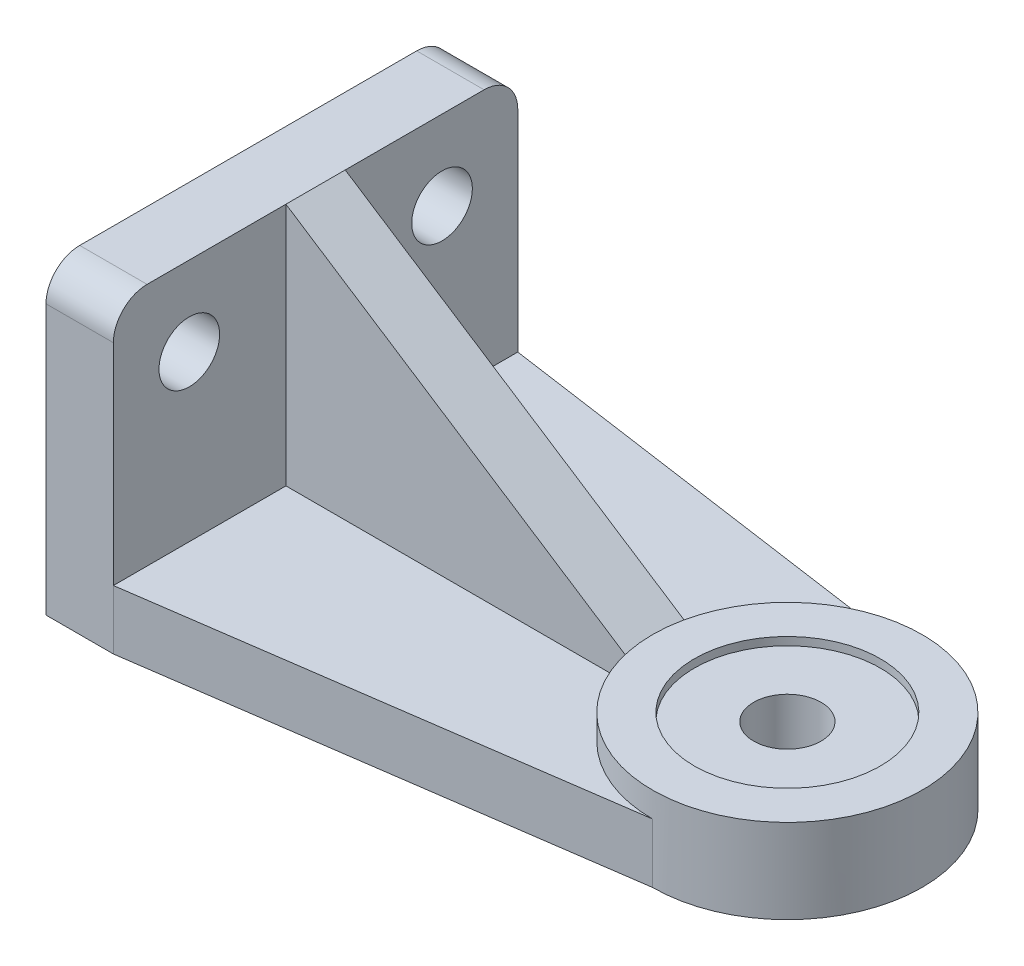
ISO-10303-21;
HEADER;
FILE_DESCRIPTION(('STEP AP214'),'2;1');
FILE_NAME('part.step','',(''),(''),'','','');
FILE_SCHEMA(('AUTOMOTIVE_DESIGN { 1 0 10303 214 1 1 1 1 }'));
ENDSEC;
DATA;
#1=APPLICATION_CONTEXT('core data for automotive mechanical design processes');
#2=APPLICATION_PROTOCOL_DEFINITION('international standard','automotive_design',2000,#1);
#3=PRODUCT_CONTEXT('',#1,'mechanical');
#4=PRODUCT('Part','Part','',(#3));
#5=PRODUCT_RELATED_PRODUCT_CATEGORY('part','',(#4));
#6=PRODUCT_DEFINITION_FORMATION('','',#4);
#7=PRODUCT_DEFINITION_CONTEXT('part definition',#1,'design');
#8=PRODUCT_DEFINITION('design','',#6,#7);
#9=PRODUCT_DEFINITION_SHAPE('','',#8);
#10=(LENGTH_UNIT() NAMED_UNIT(*) SI_UNIT(.MILLI.,.METRE.));
#11=(NAMED_UNIT(*) PLANE_ANGLE_UNIT() SI_UNIT($,.RADIAN.));
#12=(NAMED_UNIT(*) SI_UNIT($,.STERADIAN.) SOLID_ANGLE_UNIT());
#13=UNCERTAINTY_MEASURE_WITH_UNIT(LENGTH_MEASURE(1.E-05),#10,'distance_accuracy_value','');
#14=(GEOMETRIC_REPRESENTATION_CONTEXT(3) GLOBAL_UNCERTAINTY_ASSIGNED_CONTEXT((#13)) GLOBAL_UNIT_ASSIGNED_CONTEXT((#10,
#11,#12)) REPRESENTATION_CONTEXT('',''));
#15=CARTESIAN_POINT('',(0.,0.,0.));
#16=DIRECTION('',(0.,0.,1.));
#17=DIRECTION('',(1.,0.,0.));
#18=AXIS2_PLACEMENT_3D('',#15,#16,#17);
#19=CARTESIAN_POINT('',(0.,11.176,0.));
#20=DIRECTION('',(0.,1.,0.));
#21=DIRECTION('',(0.,0.,1.));
#22=AXIS2_PLACEMENT_3D('',#19,#20,#21);
#23=PLANE('',#22);
#24=DIRECTION('',(0.,0.,1.));
#25=VECTOR('',#24,1.);
#26=CARTESIAN_POINT('',(-88.9,11.176,-38.1));
#27=LINE('',#26,#25);
#28=CARTESIAN_POINT('',(-88.9,11.176,-38.1));
#29=VERTEX_POINT('',#28);
#30=CARTESIAN_POINT('',(-88.9,11.176,-5.588));
#31=VERTEX_POINT('',#30);
#32=EDGE_CURVE('E162',#29,#31,#27,.T.);
#33=ORIENTED_EDGE('',*,*,#32,.T.);
#34=DIRECTION('',(1.,0.,0.));
#35=VECTOR('',#34,1.);
#36=CARTESIAN_POINT('',(-22.86,11.176,-5.588));
#37=LINE('',#36,#35);
#38=CARTESIAN_POINT('',(-24.7776967452586,11.176,-5.588));
#39=VERTEX_POINT('',#38);
#40=EDGE_CURVE('E235',#31,#39,#37,.T.);
#41=ORIENTED_EDGE('',*,*,#40,.T.);
#42=CARTESIAN_POINT('',(0.,11.176,0.));
#43=DIRECTION('',(0.,-1.,0.));
#44=DIRECTION('',(0.,0.,1.));
#45=AXIS2_PLACEMENT_3D('',#42,#43,#44);
#46=CIRCLE('',#45,25.4);
#47=CARTESIAN_POINT('',(0.,11.176,-25.4));
#48=VERTEX_POINT('',#47);
#49=EDGE_CURVE('E176',#39,#48,#46,.T.);
#50=ORIENTED_EDGE('',*,*,#49,.T.);
#51=DIRECTION('',(-0.989949493661167,0.,-0.141421356237309));
#52=VECTOR('',#51,1.);
#53=CARTESIAN_POINT('',(-88.9,11.176,-38.1));
#54=LINE('',#53,#52);
#55=EDGE_CURVE('E163',#48,#29,#54,.T.);
#56=ORIENTED_EDGE('',*,*,#55,.T.);
#57=EDGE_LOOP('',(#33,#41,#50,#56));
#58=FACE_BOUND('',#57,.T.);
#59=ADVANCED_FACE('F39',(#58),#23,.T.);
#60=CARTESIAN_POINT('',(-88.9,57.15,-38.1));
#61=DIRECTION('',(-1.,0.,0.));
#62=DIRECTION('',(0.,0.,1.));
#63=AXIS2_PLACEMENT_3D('',#60,#61,#62);
#64=PLANE('',#63);
#65=CARTESIAN_POINT('',(-88.9,42.164,-23.8252));
#66=DIRECTION('',(1.,0.,0.));
#67=DIRECTION('',(0.,0.,-1.));
#68=AXIS2_PLACEMENT_3D('',#65,#66,#67);
#69=CIRCLE('',#68,5.715);
#70=CARTESIAN_POINT('',(-88.9,42.164,-29.5402));
#71=VERTEX_POINT('',#70);
#72=EDGE_CURVE('E329',#71,#71,#69,.T.);
#73=ORIENTED_EDGE('',*,*,#72,.F.);
#74=EDGE_LOOP('',(#73));
#75=FACE_BOUND('',#74,.T.);
#76=DIRECTION('',(0.,-1.,0.));
#77=VECTOR('',#76,1.);
#78=CARTESIAN_POINT('',(-88.9,57.15,-38.1));
#79=LINE('',#78,#77);
#80=CARTESIAN_POINT('',(-88.9,50.8,-38.1));
#81=VERTEX_POINT('',#80);
#82=EDGE_CURVE('E184',#81,#29,#79,.T.);
#83=ORIENTED_EDGE('',*,*,#82,.F.);
#84=CARTESIAN_POINT('',(-88.9,50.8,-31.75));
#85=DIRECTION('',(-1.,0.,0.));
#86=DIRECTION('',(0.,0.,1.));
#87=AXIS2_PLACEMENT_3D('',#84,#85,#86);
#88=CIRCLE('',#87,6.35);
#89=CARTESIAN_POINT('',(-88.9,57.15,-31.75));
#90=VERTEX_POINT('',#89);
#91=EDGE_CURVE('E225',#81,#90,#88,.F.);
#92=ORIENTED_EDGE('',*,*,#91,.T.);
#93=DIRECTION('',(0.,0.,-1.));
#94=VECTOR('',#93,1.);
#95=CARTESIAN_POINT('',(-88.9,57.15,-38.1));
#96=LINE('',#95,#94);
#97=CARTESIAN_POINT('',(-88.9,57.15,-5.58800000000002));
#98=VERTEX_POINT('',#97);
#99=EDGE_CURVE('E270',#98,#90,#96,.T.);
#100=ORIENTED_EDGE('',*,*,#99,.F.);
#101=DIRECTION('',(0.,-1.,0.));
#102=VECTOR('',#101,1.);
#103=CARTESIAN_POINT('',(-88.9,11.176,-5.588));
#104=LINE('',#103,#102);
#105=EDGE_CURVE('E319',#98,#31,#104,.T.);
#106=ORIENTED_EDGE('',*,*,#105,.T.);
#107=ORIENTED_EDGE('',*,*,#32,.F.);
#108=EDGE_LOOP('',(#83,#92,#100,#106,#107));
#109=FACE_BOUND('',#108,.T.);
#110=ADVANCED_FACE('F346',(#75,#109),#64,.F.);
#111=CARTESIAN_POINT('',(0.,15.875,0.));
#112=DIRECTION('',(0.,-1.,0.));
#113=DIRECTION('',(0.,0.,-1.));
#114=AXIS2_PLACEMENT_3D('',#111,#112,#113);
#115=CYLINDRICAL_SURFACE('',#114,25.4);
#116=CARTESIAN_POINT('',(0.,-0.635,0.));
#117=DIRECTION('',(-0.544988350595414,-0.838443616300637,0.));
#118=DIRECTION('',(0.838443616300637,-0.544988350595414,0.));
#119=AXIS2_PLACEMENT_3D('',#116,#117,#118);
#120=ELLIPSE('',#119,30.2942255223665,25.4);
#121=CARTESIAN_POINT('',(-24.7776967452586,15.4705028844181,5.588));
#122=VERTEX_POINT('',#121);
#123=CARTESIAN_POINT('',(-25.4,15.875,0.));
#124=VERTEX_POINT('',#123);
#125=EDGE_CURVE('E307',#122,#124,#120,.T.);
#126=ORIENTED_EDGE('',*,*,#125,.F.);
#127=DIRECTION('',(0.,-1.,0.));
#128=VECTOR('',#127,1.);
#129=CARTESIAN_POINT('',(-24.7776967452586,15.875,5.588));
#130=LINE('',#129,#128);
#131=CARTESIAN_POINT('',(-24.7776967452586,11.176,5.588));
#132=VERTEX_POINT('',#131);
#133=EDGE_CURVE('E301',#122,#132,#130,.T.);
#134=ORIENTED_EDGE('',*,*,#133,.T.);
#135=CARTESIAN_POINT('',(0.,11.176,25.4));
#136=VERTEX_POINT('',#135);
#137=EDGE_CURVE('E156',#136,#132,#46,.T.);
#138=ORIENTED_EDGE('',*,*,#137,.F.);
#139=DIRECTION('',(0.,-1.,0.));
#140=VECTOR('',#139,1.);
#141=CARTESIAN_POINT('',(0.,11.176,25.4));
#142=LINE('',#141,#140);
#143=CARTESIAN_POINT('',(0.,0.,25.4));
#144=VERTEX_POINT('',#143);
#145=EDGE_CURVE('E191',#136,#144,#142,.T.);
#146=ORIENTED_EDGE('',*,*,#145,.T.);
#147=CARTESIAN_POINT('',(0.,0.,0.));
#148=DIRECTION('',(0.,1.,0.));
#149=DIRECTION('',(0.,0.,1.));
#150=AXIS2_PLACEMENT_3D('',#147,#148,#149);
#151=CIRCLE('',#150,25.4);
#152=CARTESIAN_POINT('',(0.,0.,-25.4));
#153=VERTEX_POINT('',#152);
#154=EDGE_CURVE('E202',#144,#153,#151,.T.);
#155=ORIENTED_EDGE('',*,*,#154,.T.);
#156=DIRECTION('',(0.,-1.,0.));
#157=VECTOR('',#156,1.);
#158=CARTESIAN_POINT('',(0.,11.176,-25.4));
#159=LINE('',#158,#157);
#160=EDGE_CURVE('E179',#48,#153,#159,.T.);
#161=ORIENTED_EDGE('',*,*,#160,.F.);
#162=ORIENTED_EDGE('',*,*,#49,.F.);
#163=DIRECTION('',(0.,-1.,0.));
#164=VECTOR('',#163,1.);
#165=CARTESIAN_POINT('',(-24.7776967452586,15.875,-5.588));
#166=LINE('',#165,#164);
#167=CARTESIAN_POINT('',(-24.7776967452586,15.4705028844181,-5.588));
#168=VERTEX_POINT('',#167);
#169=EDGE_CURVE('E304',#168,#39,#166,.T.);
#170=ORIENTED_EDGE('',*,*,#169,.F.);
#171=EDGE_CURVE('E308',#124,#168,#120,.T.);
#172=ORIENTED_EDGE('',*,*,#171,.F.);
#173=CARTESIAN_POINT('',(0.,15.875,0.));
#174=DIRECTION('',(0.,1.,0.));
#175=DIRECTION('',(0.,0.,1.));
#176=AXIS2_PLACEMENT_3D('',#173,#174,#175);
#177=CIRCLE('',#176,25.4);
#178=EDGE_CURVE('E203',#124,#124,#177,.T.);
#179=ORIENTED_EDGE('',*,*,#178,.F.);
#180=EDGE_LOOP('',(#126,#134,#138,#146,#155,#161,#162,#170,#172,#179));
#181=FACE_BOUND('',#180,.T.);
#182=ADVANCED_FACE('F239',(#181),#115,.T.);
#183=CARTESIAN_POINT('',(0.,15.875,0.));
#184=DIRECTION('',(0.,1.,0.));
#185=DIRECTION('',(0.,0.,1.));
#186=AXIS2_PLACEMENT_3D('',#183,#184,#185);
#187=PLANE('',#186);
#188=CARTESIAN_POINT('',(0.,15.875,0.));
#189=DIRECTION('',(0.,1.,0.));
#190=DIRECTION('',(0.,0.,1.));
#191=AXIS2_PLACEMENT_3D('',#188,#189,#190);
#192=CIRCLE('',#191,17.526);
#193=CARTESIAN_POINT('',(0.,15.875,17.526));
#194=VERTEX_POINT('',#193);
#195=EDGE_CURVE('E297',#194,#194,#192,.T.);
#196=ORIENTED_EDGE('',*,*,#195,.F.);
#197=EDGE_LOOP('',(#196));
#198=FACE_BOUND('',#197,.T.);
#199=ORIENTED_EDGE('',*,*,#178,.T.);
#200=EDGE_LOOP('',(#199));
#201=FACE_BOUND('',#200,.T.);
#202=ADVANCED_FACE('F366',(#198,#201),#187,.T.);
#203=CARTESIAN_POINT('',(0.,0.,0.));
#204=DIRECTION('',(0.,1.,0.));
#205=DIRECTION('',(0.,0.,1.));
#206=AXIS2_PLACEMENT_3D('',#203,#204,#205);
#207=PLANE('',#206);
#208=CARTESIAN_POINT('',(0.,0.,0.));
#209=DIRECTION('',(0.,1.,0.));
#210=DIRECTION('',(0.,0.,1.));
#211=AXIS2_PLACEMENT_3D('',#208,#209,#210);
#212=CIRCLE('',#211,6.35);
#213=CARTESIAN_POINT('',(0.,0.,6.35));
#214=VERTEX_POINT('',#213);
#215=EDGE_CURVE('E255',#214,#214,#212,.T.);
#216=ORIENTED_EDGE('',*,*,#215,.T.);
#217=EDGE_LOOP('',(#216));
#218=FACE_BOUND('',#217,.T.);
#219=ORIENTED_EDGE('',*,*,#154,.F.);
#220=DIRECTION('',(0.989949493661167,0.,-0.14142135623731));
#221=VECTOR('',#220,1.);
#222=CARTESIAN_POINT('',(-88.9,0.,38.1));
#223=LINE('',#222,#221);
#224=CARTESIAN_POINT('',(-88.9,0.,38.1));
#225=VERTEX_POINT('',#224);
#226=EDGE_CURVE('E170',#225,#144,#223,.T.);
#227=ORIENTED_EDGE('',*,*,#226,.F.);
#228=DIRECTION('',(1.,0.,0.));
#229=VECTOR('',#228,1.);
#230=CARTESIAN_POINT('',(-88.9,0.,38.1));
#231=LINE('',#230,#229);
#232=CARTESIAN_POINT('',(-101.6,0.,38.1));
#233=VERTEX_POINT('',#232);
#234=EDGE_CURVE('E259',#233,#225,#231,.T.);
#235=ORIENTED_EDGE('',*,*,#234,.F.);
#236=DIRECTION('',(0.,0.,1.));
#237=VECTOR('',#236,1.);
#238=CARTESIAN_POINT('',(-101.6,0.,-38.1));
#239=LINE('',#238,#237);
#240=CARTESIAN_POINT('',(-101.6,0.,-38.1));
#241=VERTEX_POINT('',#240);
#242=EDGE_CURVE('E253',#241,#233,#239,.T.);
#243=ORIENTED_EDGE('',*,*,#242,.F.);
#244=DIRECTION('',(-1.,0.,0.));
#245=VECTOR('',#244,1.);
#246=CARTESIAN_POINT('',(-88.9,0.,-38.1));
#247=LINE('',#246,#245);
#248=CARTESIAN_POINT('',(-88.9,0.,-38.1));
#249=VERTEX_POINT('',#248);
#250=EDGE_CURVE('E246',#249,#241,#247,.T.);
#251=ORIENTED_EDGE('',*,*,#250,.F.);
#252=DIRECTION('',(-0.989949493661167,0.,-0.141421356237309));
#253=VECTOR('',#252,1.);
#254=CARTESIAN_POINT('',(-88.9,0.,-38.1));
#255=LINE('',#254,#253);
#256=EDGE_CURVE('E180',#153,#249,#255,.T.);
#257=ORIENTED_EDGE('',*,*,#256,.F.);
#258=EDGE_LOOP('',(#219,#227,#235,#243,#251,#257));
#259=FACE_BOUND('',#258,.T.);
#260=ADVANCED_FACE('F250',(#218,#259),#207,.F.);
#261=CARTESIAN_POINT('',(-88.9,11.176,-38.1));
#262=DIRECTION('',(-0.141421356237309,0.,0.989949493661167));
#263=DIRECTION('',(0.989949493661167,0.,0.141421356237309));
#264=AXIS2_PLACEMENT_3D('',#261,#262,#263);
#265=PLANE('',#264);
#266=ORIENTED_EDGE('',*,*,#256,.T.);
#267=DIRECTION('',(0.,-1.,0.));
#268=VECTOR('',#267,1.);
#269=CARTESIAN_POINT('',(-88.9,11.176,-38.1));
#270=LINE('',#269,#268);
#271=EDGE_CURVE('E199',#29,#249,#270,.T.);
#272=ORIENTED_EDGE('',*,*,#271,.F.);
#273=ORIENTED_EDGE('',*,*,#55,.F.);
#274=ORIENTED_EDGE('',*,*,#160,.T.);
#275=EDGE_LOOP('',(#266,#272,#273,#274));
#276=FACE_BOUND('',#275,.T.);
#277=ADVANCED_FACE('F242',(#276),#265,.F.);
#278=CARTESIAN_POINT('',(-88.9,11.176,38.1));
#279=DIRECTION('',(-0.14142135623731,0.,-0.989949493661167));
#280=DIRECTION('',(-0.989949493661167,0.,0.14142135623731));
#281=AXIS2_PLACEMENT_3D('',#278,#279,#280);
#282=PLANE('',#281);
#283=ORIENTED_EDGE('',*,*,#226,.T.);
#284=ORIENTED_EDGE('',*,*,#145,.F.);
#285=DIRECTION('',(0.989949493661167,0.,-0.14142135623731));
#286=VECTOR('',#285,1.);
#287=CARTESIAN_POINT('',(-88.9,11.176,38.1));
#288=LINE('',#287,#286);
#289=CARTESIAN_POINT('',(-88.9,11.176,38.1));
#290=VERTEX_POINT('',#289);
#291=EDGE_CURVE('E168',#290,#136,#288,.T.);
#292=ORIENTED_EDGE('',*,*,#291,.F.);
#293=DIRECTION('',(0.,-1.,0.));
#294=VECTOR('',#293,1.);
#295=CARTESIAN_POINT('',(-88.9,11.176,38.1));
#296=LINE('',#295,#294);
#297=EDGE_CURVE('E195',#290,#225,#296,.T.);
#298=ORIENTED_EDGE('',*,*,#297,.T.);
#299=EDGE_LOOP('',(#283,#284,#292,#298));
#300=FACE_BOUND('',#299,.T.);
#301=ADVANCED_FACE('F353',(#300),#282,.F.);
#302=DIRECTION('',(1.,0.,0.));
#303=VECTOR('',#302,1.);
#304=CARTESIAN_POINT('',(-22.86,11.176,5.588));
#305=LINE('',#304,#303);
#306=CARTESIAN_POINT('',(-88.9,11.176,5.588));
#307=VERTEX_POINT('',#306);
#308=EDGE_CURVE('E140',#307,#132,#305,.T.);
#309=ORIENTED_EDGE('',*,*,#308,.F.);
#310=EDGE_CURVE('E154',#307,#290,#27,.T.);
#311=ORIENTED_EDGE('',*,*,#310,.T.);
#312=ORIENTED_EDGE('',*,*,#291,.T.);
#313=ORIENTED_EDGE('',*,*,#137,.T.);
#314=EDGE_LOOP('',(#309,#311,#312,#313));
#315=FACE_BOUND('',#314,.T.);
#316=ADVANCED_FACE('F152',(#315),#23,.T.);
#317=CARTESIAN_POINT('',(-88.9,42.164,23.7998));
#318=DIRECTION('',(1.,0.,0.));
#319=DIRECTION('',(0.,0.,-1.));
#320=AXIS2_PLACEMENT_3D('',#317,#318,#319);
#321=CIRCLE('',#320,5.715);
#322=CARTESIAN_POINT('',(-88.9,42.164,18.0848));
#323=VERTEX_POINT('',#322);
#324=EDGE_CURVE('E337',#323,#323,#321,.T.);
#325=ORIENTED_EDGE('',*,*,#324,.F.);
#326=EDGE_LOOP('',(#325));
#327=FACE_BOUND('',#326,.T.);
#328=CARTESIAN_POINT('',(-88.9,57.15,31.75));
#329=VERTEX_POINT('',#328);
#330=CARTESIAN_POINT('',(-88.9,57.15,5.588));
#331=VERTEX_POINT('',#330);
#332=EDGE_CURVE('E282',#329,#331,#96,.T.);
#333=ORIENTED_EDGE('',*,*,#332,.F.);
#334=CARTESIAN_POINT('',(-88.9,50.8,31.75));
#335=DIRECTION('',(-1.,0.,0.));
#336=DIRECTION('',(0.,0.,1.));
#337=AXIS2_PLACEMENT_3D('',#334,#335,#336);
#338=CIRCLE('',#337,6.35);
#339=CARTESIAN_POINT('',(-88.9,50.8,38.1));
#340=VERTEX_POINT('',#339);
#341=EDGE_CURVE('E48',#329,#340,#338,.F.);
#342=ORIENTED_EDGE('',*,*,#341,.T.);
#343=DIRECTION('',(0.,-1.,0.));
#344=VECTOR('',#343,1.);
#345=CARTESIAN_POINT('',(-88.9,57.15,38.1));
#346=LINE('',#345,#344);
#347=EDGE_CURVE('E160',#340,#290,#346,.T.);
#348=ORIENTED_EDGE('',*,*,#347,.T.);
#349=ORIENTED_EDGE('',*,*,#310,.F.);
#350=DIRECTION('',(0.,-1.,0.));
#351=VECTOR('',#350,1.);
#352=CARTESIAN_POINT('',(-88.9,11.176,5.588));
#353=LINE('',#352,#351);
#354=EDGE_CURVE('E137',#331,#307,#353,.T.);
#355=ORIENTED_EDGE('',*,*,#354,.F.);
#356=EDGE_LOOP('',(#333,#342,#348,#349,#355));
#357=FACE_BOUND('',#356,.T.);
#358=ADVANCED_FACE('F159',(#327,#357),#64,.F.);
#359=CARTESIAN_POINT('',(-88.9,57.15,-38.1));
#360=DIRECTION('',(0.,0.,1.));
#361=DIRECTION('',(1.,0.,0.));
#362=AXIS2_PLACEMENT_3D('',#359,#360,#361);
#363=PLANE('',#362);
#364=DIRECTION('',(0.,-1.,0.));
#365=VECTOR('',#364,1.);
#366=CARTESIAN_POINT('',(-101.6,57.15,-38.1));
#367=LINE('',#366,#365);
#368=CARTESIAN_POINT('',(-101.6,50.8,-38.1));
#369=VERTEX_POINT('',#368);
#370=EDGE_CURVE('E276',#369,#241,#367,.T.);
#371=ORIENTED_EDGE('',*,*,#370,.F.);
#372=DIRECTION('',(-1.,0.,0.));
#373=VECTOR('',#372,1.);
#374=CARTESIAN_POINT('',(-88.9,50.8,-38.1));
#375=LINE('',#374,#373);
#376=EDGE_CURVE('E62',#369,#81,#375,.F.);
#377=ORIENTED_EDGE('',*,*,#376,.T.);
#378=ORIENTED_EDGE('',*,*,#82,.T.);
#379=ORIENTED_EDGE('',*,*,#271,.T.);
#380=ORIENTED_EDGE('',*,*,#250,.T.);
#381=EDGE_LOOP('',(#371,#377,#378,#379,#380));
#382=FACE_BOUND('',#381,.T.);
#383=ADVANCED_FACE('F245',(#382),#363,.F.);
#384=CARTESIAN_POINT('',(-101.6,57.15,-38.1));
#385=DIRECTION('',(1.,0.,0.));
#386=DIRECTION('',(0.,0.,-1.));
#387=AXIS2_PLACEMENT_3D('',#384,#385,#386);
#388=PLANE('',#387);
#389=CARTESIAN_POINT('',(-101.6,42.164,23.7998));
#390=DIRECTION('',(1.,0.,0.));
#391=DIRECTION('',(0.,0.,-1.));
#392=AXIS2_PLACEMENT_3D('',#389,#390,#391);
#393=CIRCLE('',#392,5.715);
#394=CARTESIAN_POINT('',(-101.6,42.164,18.0848));
#395=VERTEX_POINT('',#394);
#396=EDGE_CURVE('E333',#395,#395,#393,.T.);
#397=ORIENTED_EDGE('',*,*,#396,.T.);
#398=EDGE_LOOP('',(#397));
#399=FACE_BOUND('',#398,.T.);
#400=CARTESIAN_POINT('',(-101.6,42.164,-23.8252));
#401=DIRECTION('',(1.,0.,0.));
#402=DIRECTION('',(0.,0.,-1.));
#403=AXIS2_PLACEMENT_3D('',#400,#401,#402);
#404=CIRCLE('',#403,5.715);
#405=CARTESIAN_POINT('',(-101.6,42.164,-29.5402));
#406=VERTEX_POINT('',#405);
#407=EDGE_CURVE('E323',#406,#406,#404,.T.);
#408=ORIENTED_EDGE('',*,*,#407,.T.);
#409=EDGE_LOOP('',(#408));
#410=FACE_BOUND('',#409,.T.);
#411=DIRECTION('',(0.,0.,1.));
#412=VECTOR('',#411,1.);
#413=CARTESIAN_POINT('',(-101.6,57.15,-38.1));
#414=LINE('',#413,#412);
#415=CARTESIAN_POINT('',(-101.6,57.15,-31.75));
#416=VERTEX_POINT('',#415);
#417=CARTESIAN_POINT('',(-101.6,57.15,31.75));
#418=VERTEX_POINT('',#417);
#419=EDGE_CURVE('E265',#416,#418,#414,.T.);
#420=ORIENTED_EDGE('',*,*,#419,.F.);
#421=CARTESIAN_POINT('',(-101.6,50.8,-31.75));
#422=DIRECTION('',(1.,0.,0.));
#423=DIRECTION('',(0.,0.,-1.));
#424=AXIS2_PLACEMENT_3D('',#421,#422,#423);
#425=CIRCLE('',#424,6.35);
#426=EDGE_CURVE('E220',#416,#369,#425,.F.);
#427=ORIENTED_EDGE('',*,*,#426,.T.);
#428=ORIENTED_EDGE('',*,*,#370,.T.);
#429=ORIENTED_EDGE('',*,*,#242,.T.);
#430=DIRECTION('',(0.,-1.,0.));
#431=VECTOR('',#430,1.);
#432=CARTESIAN_POINT('',(-101.6,57.15,38.1));
#433=LINE('',#432,#431);
#434=CARTESIAN_POINT('',(-101.6,50.8,38.1));
#435=VERTEX_POINT('',#434);
#436=EDGE_CURVE('E273',#435,#233,#433,.T.);
#437=ORIENTED_EDGE('',*,*,#436,.F.);
#438=CARTESIAN_POINT('',(-101.6,50.8,31.75));
#439=DIRECTION('',(1.,0.,0.));
#440=DIRECTION('',(0.,0.,-1.));
#441=AXIS2_PLACEMENT_3D('',#438,#439,#440);
#442=CIRCLE('',#441,6.35);
#443=EDGE_CURVE('E217',#435,#418,#442,.F.);
#444=ORIENTED_EDGE('',*,*,#443,.T.);
#445=EDGE_LOOP('',(#420,#427,#428,#429,#437,#444));
#446=FACE_BOUND('',#445,.T.);
#447=ADVANCED_FACE('F351',(#399,#410,#446),#388,.F.);
#448=CARTESIAN_POINT('',(-88.9,57.15,38.1));
#449=DIRECTION('',(0.,0.,-1.));
#450=DIRECTION('',(-1.,0.,0.));
#451=AXIS2_PLACEMENT_3D('',#448,#449,#450);
#452=PLANE('',#451);
#453=ORIENTED_EDGE('',*,*,#347,.F.);
#454=DIRECTION('',(1.,0.,0.));
#455=VECTOR('',#454,1.);
#456=CARTESIAN_POINT('',(-88.9,50.8,38.1));
#457=LINE('',#456,#455);
#458=EDGE_CURVE('E11',#340,#435,#457,.F.);
#459=ORIENTED_EDGE('',*,*,#458,.T.);
#460=ORIENTED_EDGE('',*,*,#436,.T.);
#461=ORIENTED_EDGE('',*,*,#234,.T.);
#462=ORIENTED_EDGE('',*,*,#297,.F.);
#463=EDGE_LOOP('',(#453,#459,#460,#461,#462));
#464=FACE_BOUND('',#463,.T.);
#465=ADVANCED_FACE('F400',(#464),#452,.F.);
#466=CARTESIAN_POINT('',(0.,57.15,0.));
#467=DIRECTION('',(0.,-1.,0.));
#468=DIRECTION('',(0.,0.,-1.));
#469=AXIS2_PLACEMENT_3D('',#466,#467,#468);
#470=PLANE('',#469);
#471=ORIENTED_EDGE('',*,*,#99,.T.);
#472=DIRECTION('',(-1.,0.,0.));
#473=VECTOR('',#472,1.);
#474=CARTESIAN_POINT('',(0.,57.15,-31.75));
#475=LINE('',#474,#473);
#476=EDGE_CURVE('E213',#90,#416,#475,.T.);
#477=ORIENTED_EDGE('',*,*,#476,.T.);
#478=ORIENTED_EDGE('',*,*,#419,.T.);
#479=DIRECTION('',(1.,0.,0.));
#480=VECTOR('',#479,1.);
#481=CARTESIAN_POINT('',(0.,57.15,31.75));
#482=LINE('',#481,#480);
#483=EDGE_CURVE('E207',#418,#329,#482,.T.);
#484=ORIENTED_EDGE('',*,*,#483,.T.);
#485=ORIENTED_EDGE('',*,*,#332,.T.);
#486=DIRECTION('',(0.,0.,-1.));
#487=VECTOR('',#486,1.);
#488=CARTESIAN_POINT('',(-88.9,57.15,5.588));
#489=LINE('',#488,#487);
#490=EDGE_CURVE('E311',#331,#98,#489,.T.);
#491=ORIENTED_EDGE('',*,*,#490,.T.);
#492=EDGE_LOOP('',(#471,#477,#478,#484,#485,#491));
#493=FACE_BOUND('',#492,.T.);
#494=ADVANCED_FACE('F406',(#493),#470,.F.);
#495=CARTESIAN_POINT('',(0.,15.875,0.));
#496=DIRECTION('',(0.,1.,0.));
#497=DIRECTION('',(0.,0.,1.));
#498=AXIS2_PLACEMENT_3D('',#495,#496,#497);
#499=CYLINDRICAL_SURFACE('',#498,6.35);
#500=ORIENTED_EDGE('',*,*,#215,.F.);
#501=EDGE_LOOP('',(#500));
#502=FACE_BOUND('',#501,.T.);
#503=CARTESIAN_POINT('',(0.,14.351,0.));
#504=DIRECTION('',(0.,1.,0.));
#505=DIRECTION('',(0.,0.,1.));
#506=AXIS2_PLACEMENT_3D('',#503,#504,#505);
#507=CIRCLE('',#506,6.35);
#508=CARTESIAN_POINT('',(0.,14.351,6.35));
#509=VERTEX_POINT('',#508);
#510=EDGE_CURVE('E262',#509,#509,#507,.T.);
#511=ORIENTED_EDGE('',*,*,#510,.T.);
#512=EDGE_LOOP('',(#511));
#513=FACE_BOUND('',#512,.T.);
#514=ADVANCED_FACE('F409',(#502,#513),#499,.F.);
#515=CARTESIAN_POINT('',(6.35,14.351,0.));
#516=DIRECTION('',(0.,-1.,0.));
#517=DIRECTION('',(0.,0.,-1.));
#518=AXIS2_PLACEMENT_3D('',#515,#516,#517);
#519=PLANE('',#518);
#520=ORIENTED_EDGE('',*,*,#510,.F.);
#521=EDGE_LOOP('',(#520));
#522=FACE_BOUND('',#521,.T.);
#523=CARTESIAN_POINT('',(0.,14.351,0.));
#524=DIRECTION('',(0.,1.,0.));
#525=DIRECTION('',(0.,0.,1.));
#526=AXIS2_PLACEMENT_3D('',#523,#524,#525);
#527=CIRCLE('',#526,17.526);
#528=CARTESIAN_POINT('',(0.,14.351,17.526));
#529=VERTEX_POINT('',#528);
#530=EDGE_CURVE('E293',#529,#529,#527,.T.);
#531=ORIENTED_EDGE('',*,*,#530,.T.);
#532=EDGE_LOOP('',(#531));
#533=FACE_BOUND('',#532,.T.);
#534=ADVANCED_FACE('F415',(#522,#533),#519,.F.);
#535=CARTESIAN_POINT('',(0.,15.875,0.));
#536=DIRECTION('',(0.,1.,0.));
#537=DIRECTION('',(0.,0.,1.));
#538=AXIS2_PLACEMENT_3D('',#535,#536,#537);
#539=CYLINDRICAL_SURFACE('',#538,17.526);
#540=ORIENTED_EDGE('',*,*,#530,.F.);
#541=EDGE_LOOP('',(#540));
#542=FACE_BOUND('',#541,.T.);
#543=ORIENTED_EDGE('',*,*,#195,.T.);
#544=EDGE_LOOP('',(#543));
#545=FACE_BOUND('',#544,.T.);
#546=ADVANCED_FACE('F440',(#542,#545),#539,.F.);
#547=CARTESIAN_POINT('',(0.,0.,5.588));
#548=DIRECTION('',(0.,0.,1.));
#549=DIRECTION('',(1.,0.,0.));
#550=AXIS2_PLACEMENT_3D('',#547,#548,#549);
#551=PLANE('',#550);
#552=ORIENTED_EDGE('',*,*,#133,.F.);
#553=DIRECTION('',(-0.838443616300637,0.544988350595414,0.));
#554=VECTOR('',#553,1.);
#555=CARTESIAN_POINT('',(-25.4,15.875,5.588));
#556=LINE('',#555,#554);
#557=EDGE_CURVE('E143',#122,#331,#556,.T.);
#558=ORIENTED_EDGE('',*,*,#557,.T.);
#559=ORIENTED_EDGE('',*,*,#354,.T.);
#560=ORIENTED_EDGE('',*,*,#308,.T.);
#561=EDGE_LOOP('',(#552,#558,#559,#560));
#562=FACE_BOUND('',#561,.T.);
#563=ADVANCED_FACE('F139',(#562),#551,.T.);
#564=CARTESIAN_POINT('',(0.,0.,-5.588));
#565=DIRECTION('',(0.,0.,1.));
#566=DIRECTION('',(1.,0.,0.));
#567=AXIS2_PLACEMENT_3D('',#564,#565,#566);
#568=PLANE('',#567);
#569=DIRECTION('',(-0.838443616300637,0.544988350595414,0.));
#570=VECTOR('',#569,1.);
#571=CARTESIAN_POINT('',(-88.9,57.15,-5.588));
#572=LINE('',#571,#570);
#573=EDGE_CURVE('E147',#168,#98,#572,.T.);
#574=ORIENTED_EDGE('',*,*,#573,.F.);
#575=ORIENTED_EDGE('',*,*,#169,.T.);
#576=ORIENTED_EDGE('',*,*,#40,.F.);
#577=ORIENTED_EDGE('',*,*,#105,.F.);
#578=EDGE_LOOP('',(#574,#575,#576,#577));
#579=FACE_BOUND('',#578,.T.);
#580=ADVANCED_FACE('F389',(#579),#568,.F.);
#581=CARTESIAN_POINT('',(-88.9,57.15,5.588));
#582=DIRECTION('',(-0.544988350595414,-0.838443616300637,0.));
#583=DIRECTION('',(0.838443616300637,-0.544988350595414,0.));
#584=AXIS2_PLACEMENT_3D('',#581,#582,#583);
#585=PLANE('',#584);
#586=ORIENTED_EDGE('',*,*,#557,.F.);
#587=ORIENTED_EDGE('',*,*,#125,.T.);
#588=ORIENTED_EDGE('',*,*,#171,.T.);
#589=ORIENTED_EDGE('',*,*,#573,.T.);
#590=ORIENTED_EDGE('',*,*,#490,.F.);
#591=EDGE_LOOP('',(#586,#587,#588,#589,#590));
#592=FACE_BOUND('',#591,.T.);
#593=ADVANCED_FACE('F391',(#592),#585,.F.);
#594=CARTESIAN_POINT('',(-88.9,42.164,-23.8252));
#595=DIRECTION('',(1.,0.,0.));
#596=DIRECTION('',(0.,0.,-1.));
#597=AXIS2_PLACEMENT_3D('',#594,#595,#596);
#598=CYLINDRICAL_SURFACE('',#597,5.715);
#599=ORIENTED_EDGE('',*,*,#407,.F.);
#600=EDGE_LOOP('',(#599));
#601=FACE_BOUND('',#600,.T.);
#602=ORIENTED_EDGE('',*,*,#72,.T.);
#603=EDGE_LOOP('',(#602));
#604=FACE_BOUND('',#603,.T.);
#605=ADVANCED_FACE('F382',(#601,#604),#598,.F.);
#606=CARTESIAN_POINT('',(-88.9,42.164,23.7998));
#607=DIRECTION('',(1.,0.,0.));
#608=DIRECTION('',(0.,0.,-1.));
#609=AXIS2_PLACEMENT_3D('',#606,#607,#608);
#610=CYLINDRICAL_SURFACE('',#609,5.715);
#611=ORIENTED_EDGE('',*,*,#396,.F.);
#612=EDGE_LOOP('',(#611));
#613=FACE_BOUND('',#612,.T.);
#614=ORIENTED_EDGE('',*,*,#324,.T.);
#615=EDGE_LOOP('',(#614));
#616=FACE_BOUND('',#615,.T.);
#617=ADVANCED_FACE('F342',(#613,#616),#610,.F.);
#618=CARTESIAN_POINT('',(0.,50.8,-31.75));
#619=DIRECTION('',(-1.,0.,0.));
#620=DIRECTION('',(0.,0.,1.));
#621=AXIS2_PLACEMENT_3D('',#618,#619,#620);
#622=CYLINDRICAL_SURFACE('',#621,6.35);
#623=ORIENTED_EDGE('',*,*,#91,.F.);
#624=ORIENTED_EDGE('',*,*,#376,.F.);
#625=ORIENTED_EDGE('',*,*,#426,.F.);
#626=ORIENTED_EDGE('',*,*,#476,.F.);
#627=EDGE_LOOP('',(#623,#624,#625,#626));
#628=FACE_BOUND('',#627,.T.);
#629=ADVANCED_FACE('F374',(#628),#622,.T.);
#630=CARTESIAN_POINT('',(0.,50.8,31.75));
#631=DIRECTION('',(1.,0.,0.));
#632=DIRECTION('',(0.,0.,-1.));
#633=AXIS2_PLACEMENT_3D('',#630,#631,#632);
#634=CYLINDRICAL_SURFACE('',#633,6.35);
#635=ORIENTED_EDGE('',*,*,#443,.F.);
#636=ORIENTED_EDGE('',*,*,#458,.F.);
#637=ORIENTED_EDGE('',*,*,#341,.F.);
#638=ORIENTED_EDGE('',*,*,#483,.F.);
#639=EDGE_LOOP('',(#635,#636,#637,#638));
#640=FACE_BOUND('',#639,.T.);
#641=ADVANCED_FACE('F41',(#640),#634,.T.);
#642=CLOSED_SHELL('',(#59,#110,#182,#202,#260,#277,#301,#316,#358,#383,#447,#465,#494,#514,#534,
#546,#563,#580,#593,#605,#617,#629,#641));
#643=MANIFOLD_SOLID_BREP('B2',#642);
#644=ADVANCED_BREP_SHAPE_REPRESENTATION('',(#18,#643),#14);
#645=SHAPE_DEFINITION_REPRESENTATION(#9,#644);
ENDSEC;
END-ISO-10303-21;
